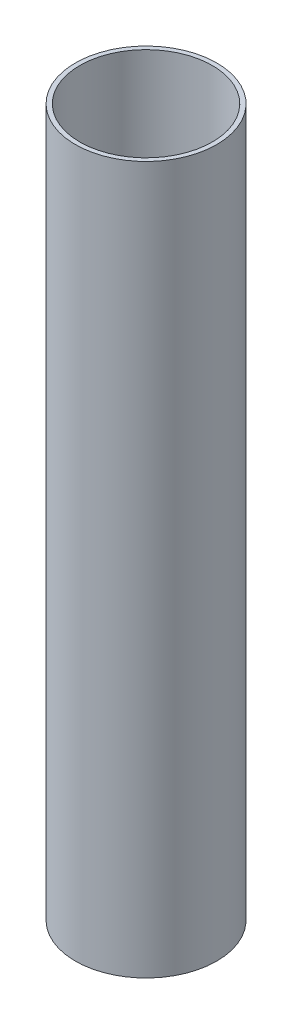
ISO-10303-21;
HEADER;
FILE_DESCRIPTION(('STEP AP214'),'2;1');
FILE_NAME('part.step','',(''),(''),'','','');
FILE_SCHEMA(('AUTOMOTIVE_DESIGN { 1 0 10303 214 1 1 1 1 }'));
ENDSEC;
DATA;
#1=APPLICATION_CONTEXT('core data for automotive mechanical design processes');
#2=APPLICATION_PROTOCOL_DEFINITION('international standard','automotive_design',2000,#1);
#3=PRODUCT_CONTEXT('',#1,'mechanical');
#4=PRODUCT('Part','Part','',(#3));
#5=PRODUCT_RELATED_PRODUCT_CATEGORY('part','',(#4));
#6=PRODUCT_DEFINITION_FORMATION('','',#4);
#7=PRODUCT_DEFINITION_CONTEXT('part definition',#1,'design');
#8=PRODUCT_DEFINITION('design','',#6,#7);
#9=PRODUCT_DEFINITION_SHAPE('','',#8);
#10=(LENGTH_UNIT() NAMED_UNIT(*) SI_UNIT(.MILLI.,.METRE.));
#11=(NAMED_UNIT(*) PLANE_ANGLE_UNIT() SI_UNIT($,.RADIAN.));
#12=(NAMED_UNIT(*) SI_UNIT($,.STERADIAN.) SOLID_ANGLE_UNIT());
#13=UNCERTAINTY_MEASURE_WITH_UNIT(LENGTH_MEASURE(1.E-05),#10,'distance_accuracy_value','');
#14=(GEOMETRIC_REPRESENTATION_CONTEXT(3) GLOBAL_UNCERTAINTY_ASSIGNED_CONTEXT((#13)) GLOBAL_UNIT_ASSIGNED_CONTEXT((#10,
#11,#12)) REPRESENTATION_CONTEXT('',''));
#15=CARTESIAN_POINT('',(0.,0.,0.));
#16=DIRECTION('',(0.,0.,1.));
#17=DIRECTION('',(1.,0.,0.));
#18=AXIS2_PLACEMENT_3D('',#15,#16,#17);
#19=CARTESIAN_POINT('',(0.,203.2,0.));
#20=DIRECTION('',(0.,1.,0.));
#21=DIRECTION('',(0.,0.,1.));
#22=AXIS2_PLACEMENT_3D('',#19,#20,#21);
#23=PLANE('',#22);
#24=CARTESIAN_POINT('',(0.,203.2,0.));
#25=DIRECTION('',(0.,1.,0.));
#26=DIRECTION('',(1.,0.,0.));
#27=AXIS2_PLACEMENT_3D('',#24,#25,#26);
#28=CIRCLE('',#27,20.32);
#29=CARTESIAN_POINT('',(20.32,203.2,0.));
#30=VERTEX_POINT('',#29);
#31=EDGE_CURVE('E11',#30,#30,#28,.T.);
#32=ORIENTED_EDGE('',*,*,#31,.T.);
#33=EDGE_LOOP('',(#32));
#34=FACE_BOUND('',#33,.T.);
#35=CARTESIAN_POINT('',(0.,203.2,0.));
#36=DIRECTION('',(0.,1.,0.));
#37=DIRECTION('',(0.,0.,1.));
#38=AXIS2_PLACEMENT_3D('',#35,#36,#37);
#39=CIRCLE('',#38,19.05);
#40=CARTESIAN_POINT('',(0.,203.2,19.05));
#41=VERTEX_POINT('',#40);
#42=EDGE_CURVE('E56',#41,#41,#39,.T.);
#43=ORIENTED_EDGE('',*,*,#42,.F.);
#44=EDGE_LOOP('',(#43));
#45=FACE_BOUND('',#44,.T.);
#46=ADVANCED_FACE('F43',(#34,#45),#23,.T.);
#47=CARTESIAN_POINT('',(0.,0.,0.));
#48=DIRECTION('',(0.,1.,0.));
#49=DIRECTION('',(0.,0.,1.));
#50=AXIS2_PLACEMENT_3D('',#47,#48,#49);
#51=PLANE('',#50);
#52=CARTESIAN_POINT('',(0.,0.,0.));
#53=DIRECTION('',(0.,1.,0.));
#54=DIRECTION('',(1.,0.,0.));
#55=AXIS2_PLACEMENT_3D('',#52,#53,#54);
#56=CIRCLE('',#55,20.32);
#57=CARTESIAN_POINT('',(20.32,0.,0.));
#58=VERTEX_POINT('',#57);
#59=EDGE_CURVE('E47',#58,#58,#56,.T.);
#60=ORIENTED_EDGE('',*,*,#59,.F.);
#61=EDGE_LOOP('',(#60));
#62=FACE_BOUND('',#61,.T.);
#63=CARTESIAN_POINT('',(0.,0.,0.));
#64=DIRECTION('',(0.,1.,0.));
#65=DIRECTION('',(0.,0.,1.));
#66=AXIS2_PLACEMENT_3D('',#63,#64,#65);
#67=CIRCLE('',#66,19.05);
#68=CARTESIAN_POINT('',(0.,0.,19.05));
#69=VERTEX_POINT('',#68);
#70=EDGE_CURVE('E58',#69,#69,#67,.T.);
#71=ORIENTED_EDGE('',*,*,#70,.T.);
#72=EDGE_LOOP('',(#71));
#73=FACE_BOUND('',#72,.T.);
#74=ADVANCED_FACE('F70',(#62,#73),#51,.F.);
#75=CARTESIAN_POINT('',(0.,203.2,0.));
#76=DIRECTION('',(0.,-1.,0.));
#77=DIRECTION('',(0.,0.,-1.));
#78=AXIS2_PLACEMENT_3D('',#75,#76,#77);
#79=CYLINDRICAL_SURFACE('',#78,20.32);
#80=ORIENTED_EDGE('',*,*,#31,.F.);
#81=EDGE_LOOP('',(#80));
#82=FACE_BOUND('',#81,.T.);
#83=ORIENTED_EDGE('',*,*,#59,.T.);
#84=EDGE_LOOP('',(#83));
#85=FACE_BOUND('',#84,.T.);
#86=ADVANCED_FACE('F45',(#82,#85),#79,.T.);
#87=CARTESIAN_POINT('',(0.,203.2,0.));
#88=DIRECTION('',(0.,-1.,0.));
#89=DIRECTION('',(0.,0.,-1.));
#90=AXIS2_PLACEMENT_3D('',#87,#88,#89);
#91=CYLINDRICAL_SURFACE('',#90,19.05);
#92=ORIENTED_EDGE('',*,*,#42,.T.);
#93=EDGE_LOOP('',(#92));
#94=FACE_BOUND('',#93,.T.);
#95=ORIENTED_EDGE('',*,*,#70,.F.);
#96=EDGE_LOOP('',(#95));
#97=FACE_BOUND('',#96,.T.);
#98=ADVANCED_FACE('F66',(#94,#97),#91,.F.);
#99=CLOSED_SHELL('',(#46,#74,#86,#98));
#100=MANIFOLD_SOLID_BREP('B2',#99);
#101=ADVANCED_BREP_SHAPE_REPRESENTATION('',(#18,#100),#14);
#102=SHAPE_DEFINITION_REPRESENTATION(#9,#101);
ENDSEC;
END-ISO-10303-21;
